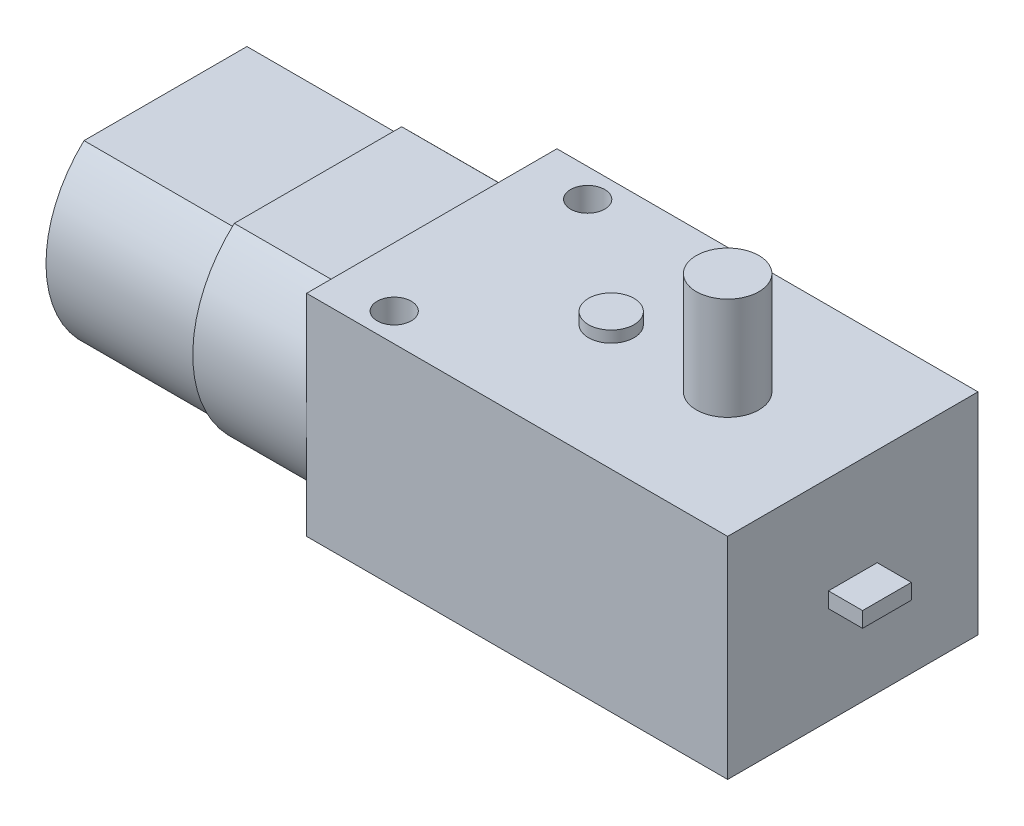
ISO-10303-21;
HEADER;
FILE_DESCRIPTION(('STEP AP214'),'2;1');
FILE_NAME('part.step','',(''),(''),'','','');
FILE_SCHEMA(('AUTOMOTIVE_DESIGN { 1 0 10303 214 1 1 1 1 }'));
ENDSEC;
DATA;
#1=APPLICATION_CONTEXT('core data for automotive mechanical design processes');
#2=APPLICATION_PROTOCOL_DEFINITION('international standard','automotive_design',2000,#1);
#3=PRODUCT_CONTEXT('',#1,'mechanical');
#4=PRODUCT('Part','Part','',(#3));
#5=PRODUCT_RELATED_PRODUCT_CATEGORY('part','',(#4));
#6=PRODUCT_DEFINITION_FORMATION('','',#4);
#7=PRODUCT_DEFINITION_CONTEXT('part definition',#1,'design');
#8=PRODUCT_DEFINITION('design','',#6,#7);
#9=PRODUCT_DEFINITION_SHAPE('','',#8);
#10=(LENGTH_UNIT() NAMED_UNIT(*) SI_UNIT(.MILLI.,.METRE.));
#11=(NAMED_UNIT(*) PLANE_ANGLE_UNIT() SI_UNIT($,.RADIAN.));
#12=(NAMED_UNIT(*) SI_UNIT($,.STERADIAN.) SOLID_ANGLE_UNIT());
#13=UNCERTAINTY_MEASURE_WITH_UNIT(LENGTH_MEASURE(1.E-05),#10,'distance_accuracy_value','');
#14=(GEOMETRIC_REPRESENTATION_CONTEXT(3) GLOBAL_UNCERTAINTY_ASSIGNED_CONTEXT((#13)) GLOBAL_UNIT_ASSIGNED_CONTEXT((#10,
#11,#12)) REPRESENTATION_CONTEXT('',''));
#15=CARTESIAN_POINT('',(0.,0.,0.));
#16=DIRECTION('',(0.,0.,1.));
#17=DIRECTION('',(1.,0.,0.));
#18=AXIS2_PLACEMENT_3D('',#15,#16,#17);
#19=CARTESIAN_POINT('',(-18.5,9.25,11.));
#20=DIRECTION('',(0.,-1.,0.));
#21=DIRECTION('',(1.,0.,0.));
#22=AXIS2_PLACEMENT_3D('',#19,#20,#21);
#23=PLANE('',#22);
#24=CARTESIAN_POINT('',(-2.72901568447225,9.25,0.));
#25=DIRECTION('',(0.,-1.,0.));
#26=DIRECTION('',(1.,0.,0.));
#27=AXIS2_PLACEMENT_3D('',#24,#25,#26);
#28=CIRCLE('',#27,2.);
#29=CARTESIAN_POINT('',(-0.729015684472253,9.25,0.));
#30=VERTEX_POINT('',#29);
#31=EDGE_CURVE('E39',#30,#30,#28,.F.);
#32=ORIENTED_EDGE('',*,*,#31,.F.);
#33=EDGE_LOOP('',(#32));
#34=FACE_BOUND('',#33,.T.);
#35=DIRECTION('',(-1.,0.,0.));
#36=VECTOR('',#35,1.);
#37=CARTESIAN_POINT('',(-18.5,9.25,-11.));
#38=LINE('',#37,#36);
#39=CARTESIAN_POINT('',(18.5,9.25000000000001,-11.));
#40=VERTEX_POINT('',#39);
#41=CARTESIAN_POINT('',(-18.5,9.25,-11.));
#42=VERTEX_POINT('',#41);
#43=EDGE_CURVE('E247',#40,#42,#38,.T.);
#44=ORIENTED_EDGE('',*,*,#43,.T.);
#45=DIRECTION('',(0.,0.,-1.));
#46=VECTOR('',#45,1.);
#47=CARTESIAN_POINT('',(-18.5,9.25,11.));
#48=LINE('',#47,#46);
#49=CARTESIAN_POINT('',(-18.5,9.25,11.));
#50=VERTEX_POINT('',#49);
#51=EDGE_CURVE('E279',#50,#42,#48,.T.);
#52=ORIENTED_EDGE('',*,*,#51,.F.);
#53=DIRECTION('',(-1.,0.,0.));
#54=VECTOR('',#53,1.);
#55=CARTESIAN_POINT('',(-18.5,9.25,11.));
#56=LINE('',#55,#54);
#57=CARTESIAN_POINT('',(18.5,9.25000000000001,11.));
#58=VERTEX_POINT('',#57);
#59=EDGE_CURVE('E248',#58,#50,#56,.T.);
#60=ORIENTED_EDGE('',*,*,#59,.F.);
#61=DIRECTION('',(0.,0.,-1.));
#62=VECTOR('',#61,1.);
#63=CARTESIAN_POINT('',(18.5,9.25000000000001,11.));
#64=LINE('',#63,#62);
#65=EDGE_CURVE('E260',#58,#40,#64,.T.);
#66=ORIENTED_EDGE('',*,*,#65,.T.);
#67=EDGE_LOOP('',(#44,#52,#60,#66));
#68=FACE_BOUND('',#67,.T.);
#69=CARTESIAN_POINT('',(-13.3,9.25,-8.5));
#70=DIRECTION('',(0.,1.,0.));
#71=DIRECTION('',(-1.,0.,0.));
#72=AXIS2_PLACEMENT_3D('',#69,#70,#71);
#73=CIRCLE('',#72,1.5);
#74=CARTESIAN_POINT('',(-14.8,9.25,-8.5));
#75=VERTEX_POINT('',#74);
#76=EDGE_CURVE('E288',#75,#75,#73,.T.);
#77=ORIENTED_EDGE('',*,*,#76,.F.);
#78=EDGE_LOOP('',(#77));
#79=FACE_BOUND('',#78,.T.);
#80=CARTESIAN_POINT('',(-13.3,9.25,8.5));
#81=DIRECTION('',(0.,1.,0.));
#82=DIRECTION('',(1.,0.,0.));
#83=AXIS2_PLACEMENT_3D('',#80,#81,#82);
#84=CIRCLE('',#83,1.5);
#85=CARTESIAN_POINT('',(-11.8,9.25,8.5));
#86=VERTEX_POINT('',#85);
#87=EDGE_CURVE('E291',#86,#86,#84,.T.);
#88=ORIENTED_EDGE('',*,*,#87,.F.);
#89=EDGE_LOOP('',(#88));
#90=FACE_BOUND('',#89,.T.);
#91=CARTESIAN_POINT('',(7.5,9.25000000000001,0.));
#92=DIRECTION('',(0.,-1.,0.));
#93=DIRECTION('',(1.,0.,0.));
#94=AXIS2_PLACEMENT_3D('',#91,#92,#93);
#95=CIRCLE('',#94,2.75);
#96=CARTESIAN_POINT('',(10.25,9.25000000000001,0.));
#97=VERTEX_POINT('',#96);
#98=EDGE_CURVE('E11',#97,#97,#95,.F.);
#99=ORIENTED_EDGE('',*,*,#98,.F.);
#100=EDGE_LOOP('',(#99));
#101=FACE_BOUND('',#100,.T.);
#102=ADVANCED_FACE('F32',(#34,#68,#79,#90,#101),#23,.F.);
#103=CARTESIAN_POINT('',(18.5,9.25000000000001,11.));
#104=DIRECTION('',(-1.,0.,0.));
#105=DIRECTION('',(0.,0.,1.));
#106=AXIS2_PLACEMENT_3D('',#103,#104,#105);
#107=PLANE('',#106);
#108=DIRECTION('',(0.,1.,0.));
#109=VECTOR('',#108,1.);
#110=CARTESIAN_POINT('',(18.5,9.25000000000001,-11.));
#111=LINE('',#110,#109);
#112=CARTESIAN_POINT('',(18.5,-9.25000000000001,-11.));
#113=VERTEX_POINT('',#112);
#114=EDGE_CURVE('E252',#113,#40,#111,.T.);
#115=ORIENTED_EDGE('',*,*,#114,.T.);
#116=ORIENTED_EDGE('',*,*,#65,.F.);
#117=DIRECTION('',(0.,1.,0.));
#118=VECTOR('',#117,1.);
#119=CARTESIAN_POINT('',(18.5,9.25000000000001,11.));
#120=LINE('',#119,#118);
#121=CARTESIAN_POINT('',(18.5,-9.25000000000001,11.));
#122=VERTEX_POINT('',#121);
#123=EDGE_CURVE('E258',#122,#58,#120,.T.);
#124=ORIENTED_EDGE('',*,*,#123,.F.);
#125=DIRECTION('',(0.,0.,-1.));
#126=VECTOR('',#125,1.);
#127=CARTESIAN_POINT('',(18.5,-9.25000000000001,11.));
#128=LINE('',#127,#126);
#129=EDGE_CURVE('E272',#122,#113,#128,.T.);
#130=ORIENTED_EDGE('',*,*,#129,.T.);
#131=EDGE_LOOP('',(#115,#116,#124,#130));
#132=FACE_BOUND('',#131,.T.);
#133=DIRECTION('',(0.,-1.,0.));
#134=VECTOR('',#133,1.);
#135=CARTESIAN_POINT('',(18.5,0.677310811503351,2.14268602184749));
#136=LINE('',#135,#134);
#137=CARTESIAN_POINT('',(18.5,0.677310811503351,2.14268602184749));
#138=VERTEX_POINT('',#137);
#139=CARTESIAN_POINT('',(18.5,-0.677310811503351,2.14268602184749));
#140=VERTEX_POINT('',#139);
#141=EDGE_CURVE('E176',#138,#140,#136,.T.);
#142=ORIENTED_EDGE('',*,*,#141,.F.);
#143=DIRECTION('',(0.,0.,1.));
#144=VECTOR('',#143,1.);
#145=CARTESIAN_POINT('',(18.5,0.677310811503351,-2.14268602184749));
#146=LINE('',#145,#144);
#147=CARTESIAN_POINT('',(18.5,0.677310811503351,-2.14268602184749));
#148=VERTEX_POINT('',#147);
#149=EDGE_CURVE('E173',#148,#138,#146,.T.);
#150=ORIENTED_EDGE('',*,*,#149,.F.);
#151=DIRECTION('',(0.,1.,0.));
#152=VECTOR('',#151,1.);
#153=CARTESIAN_POINT('',(18.5,0.677310811503351,-2.14268602184749));
#154=LINE('',#153,#152);
#155=CARTESIAN_POINT('',(18.5,-0.677310811503351,-2.14268602184749));
#156=VERTEX_POINT('',#155);
#157=EDGE_CURVE('E51',#156,#148,#154,.T.);
#158=ORIENTED_EDGE('',*,*,#157,.F.);
#159=DIRECTION('',(0.,0.,-1.));
#160=VECTOR('',#159,1.);
#161=CARTESIAN_POINT('',(18.5,-0.677310811503351,-2.14268602184749));
#162=LINE('',#161,#160);
#163=EDGE_CURVE('E46',#140,#156,#162,.T.);
#164=ORIENTED_EDGE('',*,*,#163,.F.);
#165=EDGE_LOOP('',(#142,#150,#158,#164));
#166=FACE_BOUND('',#165,.T.);
#167=ADVANCED_FACE('F329',(#132,#166),#107,.F.);
#168=CARTESIAN_POINT('',(-28.5,-0.430998927658059,0.));
#169=DIRECTION('',(-1.,0.,0.));
#170=DIRECTION('',(0.,0.,1.));
#171=AXIS2_PLACEMENT_3D('',#168,#169,#170);
#172=PLANE('',#171);
#173=CARTESIAN_POINT('',(-28.5,-0.430998927658059,0.));
#174=DIRECTION('',(-1.,0.,0.));
#175=DIRECTION('',(0.,0.,1.));
#176=AXIS2_PLACEMENT_3D('',#173,#174,#175);
#177=CIRCLE('',#176,11.);
#178=CARTESIAN_POINT('',(-28.5,7.75,-7.3533160237853));
#179=VERTEX_POINT('',#178);
#180=CARTESIAN_POINT('',(-28.5,-9.5,-6.22520839409097));
#181=VERTEX_POINT('',#180);
#182=EDGE_CURVE('E212',#179,#181,#177,.T.);
#183=ORIENTED_EDGE('',*,*,#182,.T.);
#184=DIRECTION('',(0.,0.,1.));
#185=VECTOR('',#184,1.);
#186=CARTESIAN_POINT('',(-28.5,-9.5,-6.22520839409097));
#187=LINE('',#186,#185);
#188=CARTESIAN_POINT('',(-28.5,-9.5,6.22520839409097));
#189=VERTEX_POINT('',#188);
#190=EDGE_CURVE('E215',#181,#189,#187,.T.);
#191=ORIENTED_EDGE('',*,*,#190,.T.);
#192=CARTESIAN_POINT('',(-28.5,-0.430998927658059,0.));
#193=DIRECTION('',(-1.,0.,0.));
#194=DIRECTION('',(0.,0.,1.));
#195=AXIS2_PLACEMENT_3D('',#192,#193,#194);
#196=CIRCLE('',#195,11.);
#197=CARTESIAN_POINT('',(-28.5,7.75,7.3533160237853));
#198=VERTEX_POINT('',#197);
#199=EDGE_CURVE('E218',#189,#198,#196,.T.);
#200=ORIENTED_EDGE('',*,*,#199,.T.);
#201=DIRECTION('',(0.,0.,-1.));
#202=VECTOR('',#201,1.);
#203=CARTESIAN_POINT('',(-28.5,7.75,-7.3533160237853));
#204=LINE('',#203,#202);
#205=EDGE_CURVE('E220',#198,#179,#204,.T.);
#206=ORIENTED_EDGE('',*,*,#205,.T.);
#207=EDGE_LOOP('',(#183,#191,#200,#206));
#208=FACE_BOUND('',#207,.T.);
#209=DIRECTION('',(0.,0.,1.));
#210=VECTOR('',#209,1.);
#211=CARTESIAN_POINT('',(-28.5,-9.,-6.06813155940135));
#212=LINE('',#211,#210);
#213=CARTESIAN_POINT('',(-28.5,-9.,-6.06813155940135));
#214=VERTEX_POINT('',#213);
#215=CARTESIAN_POINT('',(-28.5,-9.00000000000001,6.06813155940134));
#216=VERTEX_POINT('',#215);
#217=EDGE_CURVE('E180',#214,#216,#212,.T.);
#218=ORIENTED_EDGE('',*,*,#217,.F.);
#219=CARTESIAN_POINT('',(-28.5,-0.430998927658059,0.));
#220=DIRECTION('',(-1.,0.,0.));
#221=DIRECTION('',(0.,0.,1.));
#222=AXIS2_PLACEMENT_3D('',#219,#220,#221);
#223=CIRCLE('',#222,10.5);
#224=CARTESIAN_POINT('',(-28.5,7.25,-7.15906805899453));
#225=VERTEX_POINT('',#224);
#226=EDGE_CURVE('E177',#225,#214,#223,.T.);
#227=ORIENTED_EDGE('',*,*,#226,.F.);
#228=DIRECTION('',(0.,0.,-1.));
#229=VECTOR('',#228,1.);
#230=CARTESIAN_POINT('',(-28.5,7.25,7.15906805899453));
#231=LINE('',#230,#229);
#232=CARTESIAN_POINT('',(-28.5,7.25,7.15906805899453));
#233=VERTEX_POINT('',#232);
#234=EDGE_CURVE('E190',#233,#225,#231,.T.);
#235=ORIENTED_EDGE('',*,*,#234,.F.);
#236=CARTESIAN_POINT('',(-28.5,-0.430998927658059,0.));
#237=DIRECTION('',(-1.,0.,0.));
#238=DIRECTION('',(0.,0.,1.));
#239=AXIS2_PLACEMENT_3D('',#236,#237,#238);
#240=CIRCLE('',#239,10.5);
#241=EDGE_CURVE('E198',#216,#233,#240,.T.);
#242=ORIENTED_EDGE('',*,*,#241,.F.);
#243=EDGE_LOOP('',(#218,#227,#235,#242));
#244=FACE_BOUND('',#243,.T.);
#245=ADVANCED_FACE('F334',(#208,#244),#172,.T.);
#246=CARTESIAN_POINT('',(-18.5,9.25,11.));
#247=DIRECTION('',(1.,0.,0.));
#248=DIRECTION('',(0.,0.,-1.));
#249=AXIS2_PLACEMENT_3D('',#246,#247,#248);
#250=PLANE('',#249);
#251=CARTESIAN_POINT('',(-18.5,-0.430998927658059,0.));
#252=DIRECTION('',(-1.,0.,0.));
#253=DIRECTION('',(0.,0.,1.));
#254=AXIS2_PLACEMENT_3D('',#251,#252,#253);
#255=CIRCLE('',#254,11.);
#256=CARTESIAN_POINT('',(-18.5,-0.430998927658059,-11.));
#257=VERTEX_POINT('',#256);
#258=CARTESIAN_POINT('',(-18.5,-9.25,-6.5745889670786));
#259=VERTEX_POINT('',#258);
#260=EDGE_CURVE('E227',#257,#259,#255,.T.);
#261=ORIENTED_EDGE('',*,*,#260,.F.);
#262=DIRECTION('',(0.,-1.,0.));
#263=VECTOR('',#262,1.);
#264=CARTESIAN_POINT('',(-18.5,9.25,-11.));
#265=LINE('',#264,#263);
#266=CARTESIAN_POINT('',(-18.5,-9.25,-11.));
#267=VERTEX_POINT('',#266);
#268=EDGE_CURVE('E263',#257,#267,#265,.T.);
#269=ORIENTED_EDGE('',*,*,#268,.T.);
#270=DIRECTION('',(0.,0.,-1.));
#271=VECTOR('',#270,1.);
#272=CARTESIAN_POINT('',(-18.5,-9.25,11.));
#273=LINE('',#272,#271);
#274=EDGE_CURVE('E275',#259,#267,#273,.T.);
#275=ORIENTED_EDGE('',*,*,#274,.F.);
#276=EDGE_LOOP('',(#261,#269,#275));
#277=FACE_BOUND('',#276,.T.);
#278=ADVANCED_FACE('F499',(#277),#250,.F.);
#279=CARTESIAN_POINT('',(-18.5,7.75,-7.3533160237853));
#280=VERTEX_POINT('',#279);
#281=EDGE_CURVE('E223',#280,#257,#255,.T.);
#282=ORIENTED_EDGE('',*,*,#281,.F.);
#283=DIRECTION('',(0.,0.,-1.));
#284=VECTOR('',#283,1.);
#285=CARTESIAN_POINT('',(-18.5,7.75,-7.3533160237853));
#286=LINE('',#285,#284);
#287=CARTESIAN_POINT('',(-18.5,7.75,7.3533160237853));
#288=VERTEX_POINT('',#287);
#289=EDGE_CURVE('E216',#288,#280,#286,.T.);
#290=ORIENTED_EDGE('',*,*,#289,.F.);
#291=CARTESIAN_POINT('',(-18.5,-0.430998927658059,0.));
#292=DIRECTION('',(-1.,0.,0.));
#293=DIRECTION('',(0.,0.,1.));
#294=AXIS2_PLACEMENT_3D('',#291,#292,#293);
#295=CIRCLE('',#294,11.);
#296=CARTESIAN_POINT('',(-18.5,-0.430998927658059,11.));
#297=VERTEX_POINT('',#296);
#298=EDGE_CURVE('E233',#297,#288,#295,.T.);
#299=ORIENTED_EDGE('',*,*,#298,.F.);
#300=DIRECTION('',(0.,-1.,0.));
#301=VECTOR('',#300,1.);
#302=CARTESIAN_POINT('',(-18.5,9.25,11.));
#303=LINE('',#302,#301);
#304=EDGE_CURVE('E253',#50,#297,#303,.T.);
#305=ORIENTED_EDGE('',*,*,#304,.F.);
#306=ORIENTED_EDGE('',*,*,#51,.T.);
#307=EDGE_CURVE('E264',#42,#257,#265,.T.);
#308=ORIENTED_EDGE('',*,*,#307,.T.);
#309=EDGE_LOOP('',(#282,#290,#299,#305,#306,#308));
#310=FACE_BOUND('',#309,.T.);
#311=ADVANCED_FACE('F554',(#310),#250,.F.);
#312=CARTESIAN_POINT('',(-18.5,-9.25,6.5745889670786));
#313=VERTEX_POINT('',#312);
#314=EDGE_CURVE('E232',#313,#297,#295,.T.);
#315=ORIENTED_EDGE('',*,*,#314,.F.);
#316=CARTESIAN_POINT('',(-18.5,-9.25,11.));
#317=VERTEX_POINT('',#316);
#318=EDGE_CURVE('E276',#317,#313,#273,.T.);
#319=ORIENTED_EDGE('',*,*,#318,.F.);
#320=EDGE_CURVE('E251',#297,#317,#303,.T.);
#321=ORIENTED_EDGE('',*,*,#320,.F.);
#322=EDGE_LOOP('',(#315,#319,#321));
#323=FACE_BOUND('',#322,.T.);
#324=ADVANCED_FACE('F556',(#323),#250,.F.);
#325=CARTESIAN_POINT('',(-18.5,-9.25,11.));
#326=DIRECTION('',(0.,1.,0.));
#327=DIRECTION('',(-1.,0.,0.));
#328=AXIS2_PLACEMENT_3D('',#325,#326,#327);
#329=PLANE('',#328);
#330=CARTESIAN_POINT('',(-13.3,-9.25,8.5));
#331=DIRECTION('',(0.,1.,0.));
#332=DIRECTION('',(-1.,0.,0.));
#333=AXIS2_PLACEMENT_3D('',#330,#331,#332);
#334=CIRCLE('',#333,1.5);
#335=CARTESIAN_POINT('',(-14.8,-9.25,8.5));
#336=VERTEX_POINT('',#335);
#337=EDGE_CURVE('E289',#336,#336,#334,.T.);
#338=ORIENTED_EDGE('',*,*,#337,.T.);
#339=EDGE_LOOP('',(#338));
#340=FACE_BOUND('',#339,.T.);
#341=CARTESIAN_POINT('',(-13.3,-9.25,-8.5));
#342=DIRECTION('',(0.,1.,0.));
#343=DIRECTION('',(-1.,0.,0.));
#344=AXIS2_PLACEMENT_3D('',#341,#342,#343);
#345=CIRCLE('',#344,1.5);
#346=CARTESIAN_POINT('',(-14.8,-9.25,-8.5));
#347=VERTEX_POINT('',#346);
#348=EDGE_CURVE('E285',#347,#347,#345,.T.);
#349=ORIENTED_EDGE('',*,*,#348,.T.);
#350=EDGE_LOOP('',(#349));
#351=FACE_BOUND('',#350,.T.);
#352=DIRECTION('',(1.,0.,0.));
#353=VECTOR('',#352,1.);
#354=CARTESIAN_POINT('',(-18.5,-9.25,-11.));
#355=LINE('',#354,#353);
#356=EDGE_CURVE('E267',#267,#113,#355,.T.);
#357=ORIENTED_EDGE('',*,*,#356,.T.);
#358=ORIENTED_EDGE('',*,*,#129,.F.);
#359=DIRECTION('',(1.,0.,0.));
#360=VECTOR('',#359,1.);
#361=CARTESIAN_POINT('',(-18.5,-9.25,11.));
#362=LINE('',#361,#360);
#363=EDGE_CURVE('E256',#317,#122,#362,.T.);
#364=ORIENTED_EDGE('',*,*,#363,.F.);
#365=ORIENTED_EDGE('',*,*,#318,.T.);
#366=EDGE_CURVE('E280',#313,#259,#273,.T.);
#367=ORIENTED_EDGE('',*,*,#366,.T.);
#368=ORIENTED_EDGE('',*,*,#274,.T.);
#369=EDGE_LOOP('',(#357,#358,#364,#365,#367,#368));
#370=FACE_BOUND('',#369,.T.);
#371=ADVANCED_FACE('F570',(#340,#351,#370),#329,.F.);
#372=CARTESIAN_POINT('',(0.,0.,11.));
#373=DIRECTION('',(0.,0.,-1.));
#374=DIRECTION('',(-1.,0.,0.));
#375=AXIS2_PLACEMENT_3D('',#372,#373,#374);
#376=PLANE('',#375);
#377=ORIENTED_EDGE('',*,*,#59,.T.);
#378=ORIENTED_EDGE('',*,*,#304,.T.);
#379=ORIENTED_EDGE('',*,*,#320,.T.);
#380=ORIENTED_EDGE('',*,*,#363,.T.);
#381=ORIENTED_EDGE('',*,*,#123,.T.);
#382=EDGE_LOOP('',(#377,#378,#379,#380,#381));
#383=FACE_BOUND('',#382,.T.);
#384=ADVANCED_FACE('F578',(#383),#376,.F.);
#385=CARTESIAN_POINT('',(0.,0.,-11.));
#386=DIRECTION('',(0.,0.,-1.));
#387=DIRECTION('',(-1.,0.,0.));
#388=AXIS2_PLACEMENT_3D('',#385,#386,#387);
#389=PLANE('',#388);
#390=ORIENTED_EDGE('',*,*,#43,.F.);
#391=ORIENTED_EDGE('',*,*,#114,.F.);
#392=ORIENTED_EDGE('',*,*,#356,.F.);
#393=ORIENTED_EDGE('',*,*,#268,.F.);
#394=ORIENTED_EDGE('',*,*,#307,.F.);
#395=EDGE_LOOP('',(#390,#391,#392,#393,#394));
#396=FACE_BOUND('',#395,.T.);
#397=ADVANCED_FACE('F544',(#396),#389,.T.);
#398=CARTESIAN_POINT('',(-28.5,-0.430998927658059,0.));
#399=DIRECTION('',(1.,0.,0.));
#400=DIRECTION('',(0.,0.,-1.));
#401=AXIS2_PLACEMENT_3D('',#398,#399,#400);
#402=CYLINDRICAL_SURFACE('',#401,11.);
#403=ORIENTED_EDGE('',*,*,#281,.T.);
#404=ORIENTED_EDGE('',*,*,#260,.T.);
#405=CARTESIAN_POINT('',(-18.5,-9.5,-6.22520839409097));
#406=VERTEX_POINT('',#405);
#407=EDGE_CURVE('E211',#259,#406,#255,.T.);
#408=ORIENTED_EDGE('',*,*,#407,.T.);
#409=DIRECTION('',(1.,0.,0.));
#410=VECTOR('',#409,1.);
#411=CARTESIAN_POINT('',(-28.5,-9.5,-6.22520839409097));
#412=LINE('',#411,#410);
#413=EDGE_CURVE('E244',#181,#406,#412,.T.);
#414=ORIENTED_EDGE('',*,*,#413,.F.);
#415=ORIENTED_EDGE('',*,*,#182,.F.);
#416=DIRECTION('',(1.,0.,0.));
#417=VECTOR('',#416,1.);
#418=CARTESIAN_POINT('',(-28.5,7.75,-7.3533160237853));
#419=LINE('',#418,#417);
#420=EDGE_CURVE('E222',#179,#280,#419,.T.);
#421=ORIENTED_EDGE('',*,*,#420,.T.);
#422=EDGE_LOOP('',(#403,#404,#408,#414,#415,#421));
#423=FACE_BOUND('',#422,.T.);
#424=ADVANCED_FACE('F535',(#423),#402,.T.);
#425=CARTESIAN_POINT('',(-28.5,-9.5,-6.22520839409097));
#426=DIRECTION('',(0.,1.,0.));
#427=DIRECTION('',(0.,0.,1.));
#428=AXIS2_PLACEMENT_3D('',#425,#426,#427);
#429=PLANE('',#428);
#430=DIRECTION('',(0.,0.,1.));
#431=VECTOR('',#430,1.);
#432=CARTESIAN_POINT('',(-18.5,-9.5,-6.22520839409097));
#433=LINE('',#432,#431);
#434=CARTESIAN_POINT('',(-18.5,-9.5,6.22520839409097));
#435=VERTEX_POINT('',#434);
#436=EDGE_CURVE('E226',#406,#435,#433,.T.);
#437=ORIENTED_EDGE('',*,*,#436,.T.);
#438=DIRECTION('',(1.,0.,0.));
#439=VECTOR('',#438,1.);
#440=CARTESIAN_POINT('',(-28.5,-9.5,6.22520839409097));
#441=LINE('',#440,#439);
#442=EDGE_CURVE('E241',#189,#435,#441,.T.);
#443=ORIENTED_EDGE('',*,*,#442,.F.);
#444=ORIENTED_EDGE('',*,*,#190,.F.);
#445=ORIENTED_EDGE('',*,*,#413,.T.);
#446=EDGE_LOOP('',(#437,#443,#444,#445));
#447=FACE_BOUND('',#446,.T.);
#448=ADVANCED_FACE('F526',(#447),#429,.F.);
#449=CARTESIAN_POINT('',(-28.5,-0.430998927658059,0.));
#450=DIRECTION('',(1.,0.,0.));
#451=DIRECTION('',(0.,0.,-1.));
#452=AXIS2_PLACEMENT_3D('',#449,#450,#451);
#453=CYLINDRICAL_SURFACE('',#452,11.);
#454=EDGE_CURVE('E229',#435,#313,#295,.T.);
#455=ORIENTED_EDGE('',*,*,#454,.T.);
#456=ORIENTED_EDGE('',*,*,#314,.T.);
#457=ORIENTED_EDGE('',*,*,#298,.T.);
#458=DIRECTION('',(1.,0.,0.));
#459=VECTOR('',#458,1.);
#460=CARTESIAN_POINT('',(-28.5,7.75,7.3533160237853));
#461=LINE('',#460,#459);
#462=EDGE_CURVE('E238',#198,#288,#461,.T.);
#463=ORIENTED_EDGE('',*,*,#462,.F.);
#464=ORIENTED_EDGE('',*,*,#199,.F.);
#465=ORIENTED_EDGE('',*,*,#442,.T.);
#466=EDGE_LOOP('',(#455,#456,#457,#463,#464,#465));
#467=FACE_BOUND('',#466,.T.);
#468=ADVANCED_FACE('F517',(#467),#453,.T.);
#469=CARTESIAN_POINT('',(-28.5,7.75,-7.3533160237853));
#470=DIRECTION('',(0.,-1.,0.));
#471=DIRECTION('',(0.,0.,-1.));
#472=AXIS2_PLACEMENT_3D('',#469,#470,#471);
#473=PLANE('',#472);
#474=ORIENTED_EDGE('',*,*,#289,.T.);
#475=ORIENTED_EDGE('',*,*,#420,.F.);
#476=ORIENTED_EDGE('',*,*,#205,.F.);
#477=ORIENTED_EDGE('',*,*,#462,.T.);
#478=EDGE_LOOP('',(#474,#475,#476,#477));
#479=FACE_BOUND('',#478,.T.);
#480=ADVANCED_FACE('F508',(#479),#473,.F.);
#481=CARTESIAN_POINT('',(-18.5,-0.430998927658059,0.));
#482=DIRECTION('',(-1.,0.,0.));
#483=DIRECTION('',(0.,0.,1.));
#484=AXIS2_PLACEMENT_3D('',#481,#482,#483);
#485=PLANE('',#484);
#486=ORIENTED_EDGE('',*,*,#366,.F.);
#487=ORIENTED_EDGE('',*,*,#454,.F.);
#488=ORIENTED_EDGE('',*,*,#436,.F.);
#489=ORIENTED_EDGE('',*,*,#407,.F.);
#490=EDGE_LOOP('',(#486,#487,#488,#489));
#491=FACE_BOUND('',#490,.T.);
#492=ADVANCED_FACE('F490',(#491),#485,.F.);
#493=CARTESIAN_POINT('',(-41.9,-0.430998927658059,0.));
#494=DIRECTION('',(1.,0.,0.));
#495=DIRECTION('',(0.,0.,-1.));
#496=AXIS2_PLACEMENT_3D('',#493,#494,#495);
#497=CYLINDRICAL_SURFACE('',#496,10.5);
#498=ORIENTED_EDGE('',*,*,#226,.T.);
#499=DIRECTION('',(1.,0.,0.));
#500=VECTOR('',#499,1.);
#501=CARTESIAN_POINT('',(-41.9,-9.,-6.06813155940135));
#502=LINE('',#501,#500);
#503=CARTESIAN_POINT('',(-41.9,-9.,-6.06813155940135));
#504=VERTEX_POINT('',#503);
#505=EDGE_CURVE('E209',#504,#214,#502,.T.);
#506=ORIENTED_EDGE('',*,*,#505,.F.);
#507=CARTESIAN_POINT('',(-41.9,-0.430998927658059,0.));
#508=DIRECTION('',(-1.,0.,0.));
#509=DIRECTION('',(0.,0.,1.));
#510=AXIS2_PLACEMENT_3D('',#507,#508,#509);
#511=CIRCLE('',#510,10.5);
#512=CARTESIAN_POINT('',(-41.9,7.25,-7.15906805899453));
#513=VERTEX_POINT('',#512);
#514=EDGE_CURVE('E186',#513,#504,#511,.T.);
#515=ORIENTED_EDGE('',*,*,#514,.F.);
#516=DIRECTION('',(1.,0.,0.));
#517=VECTOR('',#516,1.);
#518=CARTESIAN_POINT('',(-41.9,7.25,-7.15906805899453));
#519=LINE('',#518,#517);
#520=EDGE_CURVE('E195',#513,#225,#519,.T.);
#521=ORIENTED_EDGE('',*,*,#520,.T.);
#522=EDGE_LOOP('',(#498,#506,#515,#521));
#523=FACE_BOUND('',#522,.T.);
#524=ADVANCED_FACE('F481',(#523),#497,.T.);
#525=CARTESIAN_POINT('',(-41.9,-9.,-6.06813155940135));
#526=DIRECTION('',(0.,1.,0.));
#527=DIRECTION('',(0.,0.,1.));
#528=AXIS2_PLACEMENT_3D('',#525,#526,#527);
#529=PLANE('',#528);
#530=ORIENTED_EDGE('',*,*,#217,.T.);
#531=DIRECTION('',(1.,0.,0.));
#532=VECTOR('',#531,1.);
#533=CARTESIAN_POINT('',(-41.9,-9.00000000000001,6.06813155940134));
#534=LINE('',#533,#532);
#535=CARTESIAN_POINT('',(-41.9,-9.00000000000001,6.06813155940134));
#536=VERTEX_POINT('',#535);
#537=EDGE_CURVE('E206',#536,#216,#534,.T.);
#538=ORIENTED_EDGE('',*,*,#537,.F.);
#539=DIRECTION('',(0.,0.,1.));
#540=VECTOR('',#539,1.);
#541=CARTESIAN_POINT('',(-41.9,-9.,-6.06813155940135));
#542=LINE('',#541,#540);
#543=EDGE_CURVE('E189',#504,#536,#542,.T.);
#544=ORIENTED_EDGE('',*,*,#543,.F.);
#545=ORIENTED_EDGE('',*,*,#505,.T.);
#546=EDGE_LOOP('',(#530,#538,#544,#545));
#547=FACE_BOUND('',#546,.T.);
#548=ADVANCED_FACE('F472',(#547),#529,.F.);
#549=CARTESIAN_POINT('',(-41.9,-0.430998927658059,0.));
#550=DIRECTION('',(1.,0.,0.));
#551=DIRECTION('',(0.,0.,-1.));
#552=AXIS2_PLACEMENT_3D('',#549,#550,#551);
#553=CYLINDRICAL_SURFACE('',#552,10.5);
#554=ORIENTED_EDGE('',*,*,#241,.T.);
#555=DIRECTION('',(1.,0.,0.));
#556=VECTOR('',#555,1.);
#557=CARTESIAN_POINT('',(-41.9,7.25,7.15906805899453));
#558=LINE('',#557,#556);
#559=CARTESIAN_POINT('',(-41.9,7.25,7.15906805899453));
#560=VERTEX_POINT('',#559);
#561=EDGE_CURVE('E204',#560,#233,#558,.T.);
#562=ORIENTED_EDGE('',*,*,#561,.F.);
#563=CARTESIAN_POINT('',(-41.9,-0.430998927658059,0.));
#564=DIRECTION('',(-1.,0.,0.));
#565=DIRECTION('',(0.,0.,1.));
#566=AXIS2_PLACEMENT_3D('',#563,#564,#565);
#567=CIRCLE('',#566,10.5);
#568=EDGE_CURVE('E192',#536,#560,#567,.T.);
#569=ORIENTED_EDGE('',*,*,#568,.F.);
#570=ORIENTED_EDGE('',*,*,#537,.T.);
#571=EDGE_LOOP('',(#554,#562,#569,#570));
#572=FACE_BOUND('',#571,.T.);
#573=ADVANCED_FACE('F463',(#572),#553,.T.);
#574=CARTESIAN_POINT('',(-41.9,7.25,7.15906805899453));
#575=DIRECTION('',(0.,-1.,0.));
#576=DIRECTION('',(0.,0.,-1.));
#577=AXIS2_PLACEMENT_3D('',#574,#575,#576);
#578=PLANE('',#577);
#579=ORIENTED_EDGE('',*,*,#234,.T.);
#580=ORIENTED_EDGE('',*,*,#520,.F.);
#581=DIRECTION('',(0.,0.,-1.));
#582=VECTOR('',#581,1.);
#583=CARTESIAN_POINT('',(-41.9,7.25,7.15906805899453));
#584=LINE('',#583,#582);
#585=EDGE_CURVE('E194',#560,#513,#584,.T.);
#586=ORIENTED_EDGE('',*,*,#585,.F.);
#587=ORIENTED_EDGE('',*,*,#561,.T.);
#588=EDGE_LOOP('',(#579,#580,#586,#587));
#589=FACE_BOUND('',#588,.T.);
#590=ADVANCED_FACE('F454',(#589),#578,.F.);
#591=CARTESIAN_POINT('',(-41.9,-0.430998927658059,0.));
#592=DIRECTION('',(-1.,0.,0.));
#593=DIRECTION('',(0.,0.,1.));
#594=AXIS2_PLACEMENT_3D('',#591,#592,#593);
#595=PLANE('',#594);
#596=ORIENTED_EDGE('',*,*,#514,.T.);
#597=ORIENTED_EDGE('',*,*,#543,.T.);
#598=ORIENTED_EDGE('',*,*,#568,.T.);
#599=ORIENTED_EDGE('',*,*,#585,.T.);
#600=EDGE_LOOP('',(#596,#597,#598,#599));
#601=FACE_BOUND('',#600,.T.);
#602=ADVANCED_FACE('F441',(#601),#595,.T.);
#603=CARTESIAN_POINT('',(21.5,0.677310811503351,2.14268602184749));
#604=DIRECTION('',(0.,0.,-1.));
#605=DIRECTION('',(-1.,0.,0.));
#606=AXIS2_PLACEMENT_3D('',#603,#604,#605);
#607=PLANE('',#606);
#608=ORIENTED_EDGE('',*,*,#141,.T.);
#609=DIRECTION('',(-1.,0.,0.));
#610=VECTOR('',#609,1.);
#611=CARTESIAN_POINT('',(21.5,-0.677310811503351,2.14268602184749));
#612=LINE('',#611,#610);
#613=CARTESIAN_POINT('',(21.5,-0.677310811503351,2.14268602184749));
#614=VERTEX_POINT('',#613);
#615=EDGE_CURVE('E157',#614,#140,#612,.T.);
#616=ORIENTED_EDGE('',*,*,#615,.F.);
#617=DIRECTION('',(0.,-1.,0.));
#618=VECTOR('',#617,1.);
#619=CARTESIAN_POINT('',(21.5,0.677310811503351,2.14268602184749));
#620=LINE('',#619,#618);
#621=CARTESIAN_POINT('',(21.5,0.677310811503351,2.14268602184749));
#622=VERTEX_POINT('',#621);
#623=EDGE_CURVE('E164',#622,#614,#620,.T.);
#624=ORIENTED_EDGE('',*,*,#623,.F.);
#625=DIRECTION('',(-1.,0.,0.));
#626=VECTOR('',#625,1.);
#627=CARTESIAN_POINT('',(21.5,0.677310811503351,2.14268602184749));
#628=LINE('',#627,#626);
#629=EDGE_CURVE('E308',#622,#138,#628,.T.);
#630=ORIENTED_EDGE('',*,*,#629,.T.);
#631=EDGE_LOOP('',(#608,#616,#624,#630));
#632=FACE_BOUND('',#631,.T.);
#633=ADVANCED_FACE('F175',(#632),#607,.F.);
#634=CARTESIAN_POINT('',(21.5,-0.677310811503351,-2.14268602184749));
#635=DIRECTION('',(0.,1.,0.));
#636=DIRECTION('',(0.,0.,1.));
#637=AXIS2_PLACEMENT_3D('',#634,#635,#636);
#638=PLANE('',#637);
#639=ORIENTED_EDGE('',*,*,#163,.T.);
#640=DIRECTION('',(-1.,0.,0.));
#641=VECTOR('',#640,1.);
#642=CARTESIAN_POINT('',(21.5,-0.677310811503351,-2.14268602184749));
#643=LINE('',#642,#641);
#644=CARTESIAN_POINT('',(21.5,-0.677310811503351,-2.14268602184749));
#645=VERTEX_POINT('',#644);
#646=EDGE_CURVE('E160',#645,#156,#643,.T.);
#647=ORIENTED_EDGE('',*,*,#646,.F.);
#648=DIRECTION('',(0.,0.,-1.));
#649=VECTOR('',#648,1.);
#650=CARTESIAN_POINT('',(21.5,-0.677310811503351,-2.14268602184749));
#651=LINE('',#650,#649);
#652=EDGE_CURVE('E153',#614,#645,#651,.T.);
#653=ORIENTED_EDGE('',*,*,#652,.F.);
#654=ORIENTED_EDGE('',*,*,#615,.T.);
#655=EDGE_LOOP('',(#639,#647,#653,#654));
#656=FACE_BOUND('',#655,.T.);
#657=ADVANCED_FACE('F155',(#656),#638,.F.);
#658=CARTESIAN_POINT('',(21.5,0.677310811503351,-2.14268602184749));
#659=DIRECTION('',(0.,0.,1.));
#660=DIRECTION('',(1.,0.,0.));
#661=AXIS2_PLACEMENT_3D('',#658,#659,#660);
#662=PLANE('',#661);
#663=ORIENTED_EDGE('',*,*,#157,.T.);
#664=DIRECTION('',(-1.,0.,0.));
#665=VECTOR('',#664,1.);
#666=CARTESIAN_POINT('',(21.5,0.677310811503351,-2.14268602184749));
#667=LINE('',#666,#665);
#668=CARTESIAN_POINT('',(21.5,0.677310811503351,-2.14268602184749));
#669=VERTEX_POINT('',#668);
#670=EDGE_CURVE('E182',#669,#148,#667,.T.);
#671=ORIENTED_EDGE('',*,*,#670,.F.);
#672=DIRECTION('',(0.,1.,0.));
#673=VECTOR('',#672,1.);
#674=CARTESIAN_POINT('',(21.5,0.677310811503351,-2.14268602184749));
#675=LINE('',#674,#673);
#676=EDGE_CURVE('E163',#645,#669,#675,.T.);
#677=ORIENTED_EDGE('',*,*,#676,.F.);
#678=ORIENTED_EDGE('',*,*,#646,.T.);
#679=EDGE_LOOP('',(#663,#671,#677,#678));
#680=FACE_BOUND('',#679,.T.);
#681=ADVANCED_FACE('F319',(#680),#662,.F.);
#682=CARTESIAN_POINT('',(21.5,0.677310811503351,-2.14268602184749));
#683=DIRECTION('',(0.,-1.,0.));
#684=DIRECTION('',(0.,0.,-1.));
#685=AXIS2_PLACEMENT_3D('',#682,#683,#684);
#686=PLANE('',#685);
#687=ORIENTED_EDGE('',*,*,#149,.T.);
#688=ORIENTED_EDGE('',*,*,#629,.F.);
#689=DIRECTION('',(0.,0.,1.));
#690=VECTOR('',#689,1.);
#691=CARTESIAN_POINT('',(21.5,0.677310811503351,-2.14268602184749));
#692=LINE('',#691,#690);
#693=EDGE_CURVE('E169',#669,#622,#692,.T.);
#694=ORIENTED_EDGE('',*,*,#693,.F.);
#695=ORIENTED_EDGE('',*,*,#670,.T.);
#696=EDGE_LOOP('',(#687,#688,#694,#695));
#697=FACE_BOUND('',#696,.T.);
#698=ADVANCED_FACE('F317',(#697),#686,.F.);
#699=CARTESIAN_POINT('',(21.5,0.,0.));
#700=DIRECTION('',(-1.,0.,0.));
#701=DIRECTION('',(0.,0.,1.));
#702=AXIS2_PLACEMENT_3D('',#699,#700,#701);
#703=PLANE('',#702);
#704=ORIENTED_EDGE('',*,*,#623,.T.);
#705=ORIENTED_EDGE('',*,*,#652,.T.);
#706=ORIENTED_EDGE('',*,*,#676,.T.);
#707=ORIENTED_EDGE('',*,*,#693,.T.);
#708=EDGE_LOOP('',(#704,#705,#706,#707));
#709=FACE_BOUND('',#708,.T.);
#710=ADVANCED_FACE('F167',(#709),#703,.F.);
#711=CARTESIAN_POINT('',(-2.72901568447225,10.25,0.));
#712=DIRECTION('',(0.,-1.,0.));
#713=DIRECTION('',(1.,0.,0.));
#714=AXIS2_PLACEMENT_3D('',#711,#712,#713);
#715=CYLINDRICAL_SURFACE('',#714,2.);
#716=CARTESIAN_POINT('',(-2.72901568447225,10.25,0.));
#717=DIRECTION('',(0.,1.,0.));
#718=DIRECTION('',(-1.,0.,0.));
#719=AXIS2_PLACEMENT_3D('',#716,#717,#718);
#720=CIRCLE('',#719,2.);
#721=CARTESIAN_POINT('',(-4.72901568447225,10.25,0.));
#722=VERTEX_POINT('',#721);
#723=EDGE_CURVE('E287',#722,#722,#720,.T.);
#724=ORIENTED_EDGE('',*,*,#723,.F.);
#725=EDGE_LOOP('',(#724));
#726=FACE_BOUND('',#725,.T.);
#727=ORIENTED_EDGE('',*,*,#31,.T.);
#728=EDGE_LOOP('',(#727));
#729=FACE_BOUND('',#728,.T.);
#730=ADVANCED_FACE('F369',(#726,#729),#715,.T.);
#731=CARTESIAN_POINT('',(-2.72901568447225,10.25,0.));
#732=DIRECTION('',(0.,1.,0.));
#733=DIRECTION('',(-1.,0.,0.));
#734=AXIS2_PLACEMENT_3D('',#731,#732,#733);
#735=PLANE('',#734);
#736=ORIENTED_EDGE('',*,*,#723,.T.);
#737=EDGE_LOOP('',(#736));
#738=FACE_BOUND('',#737,.T.);
#739=ADVANCED_FACE('F365',(#738),#735,.T.);
#740=CARTESIAN_POINT('',(-13.3,-10.75,-8.5));
#741=DIRECTION('',(0.,1.,0.));
#742=DIRECTION('',(-1.,0.,0.));
#743=AXIS2_PLACEMENT_3D('',#740,#741,#742);
#744=CYLINDRICAL_SURFACE('',#743,1.5);
#745=ORIENTED_EDGE('',*,*,#76,.T.);
#746=EDGE_LOOP('',(#745));
#747=FACE_BOUND('',#746,.T.);
#748=ORIENTED_EDGE('',*,*,#348,.F.);
#749=EDGE_LOOP('',(#748));
#750=FACE_BOUND('',#749,.T.);
#751=ADVANCED_FACE('F359',(#747,#750),#744,.F.);
#752=CARTESIAN_POINT('',(-13.3,-10.75,8.5));
#753=DIRECTION('',(0.,1.,0.));
#754=DIRECTION('',(-1.,0.,0.));
#755=AXIS2_PLACEMENT_3D('',#752,#753,#754);
#756=CYLINDRICAL_SURFACE('',#755,1.5);
#757=ORIENTED_EDGE('',*,*,#87,.T.);
#758=EDGE_LOOP('',(#757));
#759=FACE_BOUND('',#758,.T.);
#760=ORIENTED_EDGE('',*,*,#337,.F.);
#761=EDGE_LOOP('',(#760));
#762=FACE_BOUND('',#761,.T.);
#763=ADVANCED_FACE('F350',(#759,#762),#756,.F.);
#764=CARTESIAN_POINT('',(7.5,18.25,0.));
#765=DIRECTION('',(0.,-1.,0.));
#766=DIRECTION('',(1.,0.,0.));
#767=AXIS2_PLACEMENT_3D('',#764,#765,#766);
#768=CYLINDRICAL_SURFACE('',#767,2.75);
#769=CARTESIAN_POINT('',(7.5,18.25,0.));
#770=DIRECTION('',(0.,1.,0.));
#771=DIRECTION('',(-1.,0.,0.));
#772=AXIS2_PLACEMENT_3D('',#769,#770,#771);
#773=CIRCLE('',#772,2.75);
#774=CARTESIAN_POINT('',(4.75,18.25,0.));
#775=VERTEX_POINT('',#774);
#776=EDGE_CURVE('E297',#775,#775,#773,.T.);
#777=ORIENTED_EDGE('',*,*,#776,.F.);
#778=EDGE_LOOP('',(#777));
#779=FACE_BOUND('',#778,.T.);
#780=ORIENTED_EDGE('',*,*,#98,.T.);
#781=EDGE_LOOP('',(#780));
#782=FACE_BOUND('',#781,.T.);
#783=ADVANCED_FACE('F347',(#779,#782),#768,.T.);
#784=CARTESIAN_POINT('',(7.5,18.25,0.));
#785=DIRECTION('',(0.,1.,0.));
#786=DIRECTION('',(-1.,0.,0.));
#787=AXIS2_PLACEMENT_3D('',#784,#785,#786);
#788=PLANE('',#787);
#789=ORIENTED_EDGE('',*,*,#776,.T.);
#790=EDGE_LOOP('',(#789));
#791=FACE_BOUND('',#790,.T.);
#792=ADVANCED_FACE('F349',(#791),#788,.T.);
#793=CLOSED_SHELL('',(#102,#167,#245,#278,#311,#324,#371,#384,#397,#424,#448,#468,#480,#492,
#524,#548,#573,#590,#602,#633,#657,#681,#698,#710,#730,#739,#751,#763,#783,#792));
#794=MANIFOLD_SOLID_BREP('B2',#793);
#795=ADVANCED_BREP_SHAPE_REPRESENTATION('',(#18,#794),#14);
#796=SHAPE_DEFINITION_REPRESENTATION(#9,#795);
ENDSEC;
END-ISO-10303-21;
